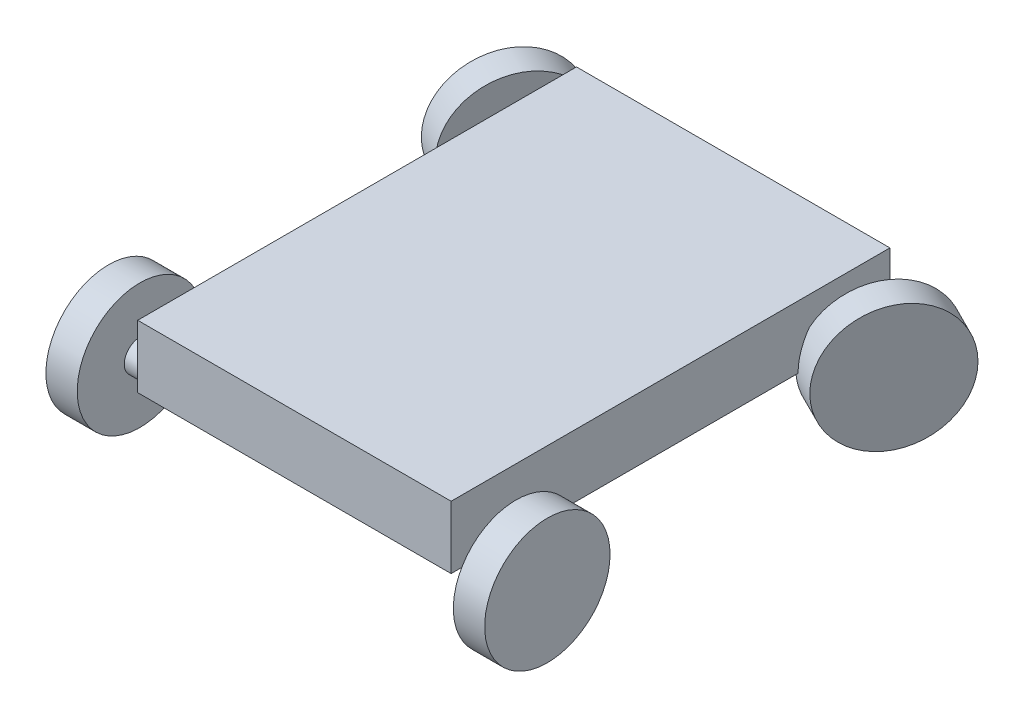
ISO-10303-21;
HEADER;
FILE_DESCRIPTION(('STEP AP214'),'2;1');
FILE_NAME('part.step','',(''),(''),'','','');
FILE_SCHEMA(('AUTOMOTIVE_DESIGN { 1 0 10303 214 1 1 1 1 }'));
ENDSEC;
DATA;
#1=APPLICATION_CONTEXT('core data for automotive mechanical design processes');
#2=APPLICATION_PROTOCOL_DEFINITION('international standard','automotive_design',2000,#1);
#3=PRODUCT_CONTEXT('',#1,'mechanical');
#4=PRODUCT('Part','Part','',(#3));
#5=PRODUCT_RELATED_PRODUCT_CATEGORY('part','',(#4));
#6=PRODUCT_DEFINITION_FORMATION('','',#4);
#7=PRODUCT_DEFINITION_CONTEXT('part definition',#1,'design');
#8=PRODUCT_DEFINITION('design','',#6,#7);
#9=PRODUCT_DEFINITION_SHAPE('','',#8);
#10=(LENGTH_UNIT() NAMED_UNIT(*) SI_UNIT(.MILLI.,.METRE.));
#11=(NAMED_UNIT(*) PLANE_ANGLE_UNIT() SI_UNIT($,.RADIAN.));
#12=(NAMED_UNIT(*) SI_UNIT($,.STERADIAN.) SOLID_ANGLE_UNIT());
#13=UNCERTAINTY_MEASURE_WITH_UNIT(LENGTH_MEASURE(1.E-05),#10,'distance_accuracy_value','');
#14=(GEOMETRIC_REPRESENTATION_CONTEXT(3) GLOBAL_UNCERTAINTY_ASSIGNED_CONTEXT((#13)) GLOBAL_UNIT_ASSIGNED_CONTEXT((#10,
#11,#12)) REPRESENTATION_CONTEXT('',''));
#15=CARTESIAN_POINT('',(0.,0.,0.));
#16=DIRECTION('',(0.,0.,1.));
#17=DIRECTION('',(1.,0.,0.));
#18=AXIS2_PLACEMENT_3D('',#15,#16,#17);
#19=CARTESIAN_POINT('',(0.,0.,0.));
#20=DIRECTION('',(0.,-1.,0.));
#21=DIRECTION('',(0.,0.,-1.));
#22=AXIS2_PLACEMENT_3D('',#19,#20,#21);
#23=PLANE('',#22);
#24=DIRECTION('',(-0.447213595499959,0.,0.894427190999916));
#25=VECTOR('',#24,1.);
#26=CARTESIAN_POINT('',(11.1412762896328,0.,5.57063814481643));
#27=LINE('',#26,#25);
#28=CARTESIAN_POINT('',(25.,0.,-22.1468092759178));
#29=VERTEX_POINT('',#28);
#30=CARTESIAN_POINT('',(24.2778640450004,0.,-20.7025373659186));
#31=VERTEX_POINT('',#30);
#32=EDGE_CURVE('E48',#29,#31,#27,.T.);
#33=ORIENTED_EDGE('',*,*,#32,.T.);
#34=DIRECTION('',(-0.894427190999916,0.,-0.447213595499959));
#35=VECTOR('',#34,1.);
#36=CARTESIAN_POINT('',(28.75,0.,-18.4664693884188));
#37=LINE('',#36,#35);
#38=CARTESIAN_POINT('',(25.,0.,-20.3414693884189));
#39=VERTEX_POINT('',#38);
#40=EDGE_CURVE('E119',#31,#39,#37,.F.);
#41=ORIENTED_EDGE('',*,*,#40,.T.);
#42=DIRECTION('',(0.,0.,-1.));
#43=VECTOR('',#42,1.);
#44=CARTESIAN_POINT('',(25.,0.,35.));
#45=LINE('',#44,#43);
#46=CARTESIAN_POINT('',(25.,0.,27.1468092759178));
#47=VERTEX_POINT('',#46);
#48=EDGE_CURVE('E108',#47,#39,#45,.T.);
#49=ORIENTED_EDGE('',*,*,#48,.F.);
#50=DIRECTION('',(1.,0.,0.));
#51=VECTOR('',#50,1.);
#52=CARTESIAN_POINT('',(-30.,0.,27.1468092759178));
#53=LINE('',#52,#51);
#54=CARTESIAN_POINT('',(-25.,0.,27.1468092759178));
#55=VERTEX_POINT('',#54);
#56=EDGE_CURVE('E207',#55,#47,#53,.T.);
#57=ORIENTED_EDGE('',*,*,#56,.F.);
#58=DIRECTION('',(0.,0.,1.));
#59=VECTOR('',#58,1.);
#60=CARTESIAN_POINT('',(-25.,0.,35.));
#61=LINE('',#60,#59);
#62=CARTESIAN_POINT('',(-25.,0.,-27.1468092759178));
#63=VERTEX_POINT('',#62);
#64=EDGE_CURVE('E191',#63,#55,#61,.T.);
#65=ORIENTED_EDGE('',*,*,#64,.F.);
#66=DIRECTION('',(1.,0.,0.));
#67=VECTOR('',#66,1.);
#68=CARTESIAN_POINT('',(-30.,0.,-27.1468092759178));
#69=LINE('',#68,#67);
#70=CARTESIAN_POINT('',(25.,0.,-27.1468092759178));
#71=VERTEX_POINT('',#70);
#72=EDGE_CURVE('E138',#63,#71,#69,.T.);
#73=ORIENTED_EDGE('',*,*,#72,.T.);
#74=EDGE_CURVE('E186',#29,#71,#45,.T.);
#75=ORIENTED_EDGE('',*,*,#74,.F.);
#76=EDGE_LOOP('',(#33,#41,#49,#57,#65,#73,#75));
#77=FACE_BOUND('',#76,.T.);
#78=ADVANCED_FACE('F33',(#77),#23,.T.);
#79=CARTESIAN_POINT('',(25.,10.,35.));
#80=DIRECTION('',(-1.,0.,0.));
#81=DIRECTION('',(0.,0.,1.));
#82=AXIS2_PLACEMENT_3D('',#79,#80,#81);
#83=PLANE('',#82);
#84=CARTESIAN_POINT('',(25.,0.,-31.5218092759178));
#85=DIRECTION('',(-1.,0.,0.));
#86=DIRECTION('',(0.,0.,-1.));
#87=AXIS2_PLACEMENT_3D('',#84,#85,#86);
#88=ELLIPSE('',#87,11.1803398874989,10.);
#89=CARTESIAN_POINT('',(25.,5.44862367942583,-22.1468092759178));
#90=VERTEX_POINT('',#89);
#91=EDGE_CURVE('E11',#90,#39,#88,.F.);
#92=ORIENTED_EDGE('',*,*,#91,.F.);
#93=DIRECTION('',(0.,1.,0.));
#94=VECTOR('',#93,1.);
#95=CARTESIAN_POINT('',(25.,10.,-22.1468092759178));
#96=LINE('',#95,#94);
#97=EDGE_CURVE('E41',#29,#90,#96,.T.);
#98=ORIENTED_EDGE('',*,*,#97,.F.);
#99=ORIENTED_EDGE('',*,*,#74,.T.);
#100=CARTESIAN_POINT('',(25.,0.,-29.6468092759178));
#101=DIRECTION('',(-1.,0.,0.));
#102=DIRECTION('',(0.,0.,1.));
#103=AXIS2_PLACEMENT_3D('',#100,#101,#102);
#104=CIRCLE('',#103,2.5);
#105=CARTESIAN_POINT('',(25.,0.,-32.1468092759178));
#106=VERTEX_POINT('',#105);
#107=EDGE_CURVE('E144',#106,#71,#104,.F.);
#108=ORIENTED_EDGE('',*,*,#107,.F.);
#109=CARTESIAN_POINT('',(25.,0.,-35.));
#110=VERTEX_POINT('',#109);
#111=EDGE_CURVE('E170',#106,#110,#45,.T.);
#112=ORIENTED_EDGE('',*,*,#111,.T.);
#113=DIRECTION('',(0.,-1.,0.));
#114=VECTOR('',#113,1.);
#115=CARTESIAN_POINT('',(25.,10.,-35.));
#116=LINE('',#115,#114);
#117=CARTESIAN_POINT('',(25.,10.,-35.));
#118=VERTEX_POINT('',#117);
#119=EDGE_CURVE('E201',#118,#110,#116,.T.);
#120=ORIENTED_EDGE('',*,*,#119,.F.);
#121=DIRECTION('',(0.,0.,-1.));
#122=VECTOR('',#121,1.);
#123=CARTESIAN_POINT('',(25.,10.,35.));
#124=LINE('',#123,#122);
#125=CARTESIAN_POINT('',(25.,10.,35.));
#126=VERTEX_POINT('',#125);
#127=EDGE_CURVE('E171',#126,#118,#124,.T.);
#128=ORIENTED_EDGE('',*,*,#127,.F.);
#129=DIRECTION('',(0.,-1.,0.));
#130=VECTOR('',#129,1.);
#131=CARTESIAN_POINT('',(25.,10.,35.));
#132=LINE('',#131,#130);
#133=CARTESIAN_POINT('',(25.,0.,35.));
#134=VERTEX_POINT('',#133);
#135=EDGE_CURVE('E181',#126,#134,#132,.T.);
#136=ORIENTED_EDGE('',*,*,#135,.T.);
#137=CARTESIAN_POINT('',(25.,0.,32.1468092759178));
#138=VERTEX_POINT('',#137);
#139=EDGE_CURVE('E182',#134,#138,#45,.T.);
#140=ORIENTED_EDGE('',*,*,#139,.T.);
#141=CARTESIAN_POINT('',(25.,0.,29.6468092759178));
#142=DIRECTION('',(-1.,0.,0.));
#143=DIRECTION('',(0.,0.,1.));
#144=AXIS2_PLACEMENT_3D('',#141,#142,#143);
#145=CIRCLE('',#144,2.5);
#146=EDGE_CURVE('E168',#138,#47,#145,.T.);
#147=ORIENTED_EDGE('',*,*,#146,.T.);
#148=ORIENTED_EDGE('',*,*,#48,.T.);
#149=EDGE_LOOP('',(#92,#98,#99,#108,#112,#120,#128,#136,#140,#147,#148));
#150=FACE_BOUND('',#149,.T.);
#151=ADVANCED_FACE('F35',(#150),#83,.F.);
#152=CARTESIAN_POINT('',(-30.,0.,-29.6468092759178));
#153=DIRECTION('',(1.,0.,0.));
#154=DIRECTION('',(0.,0.,-1.));
#155=AXIS2_PLACEMENT_3D('',#152,#153,#154);
#156=CYLINDRICAL_SURFACE('',#155,2.5);
#157=CARTESIAN_POINT('',(28.75,0.,-29.6468092759178));
#158=DIRECTION('',(0.894427190999916,0.,0.447213595499959));
#159=DIRECTION('',(0.447213595499959,0.,-0.894427190999915));
#160=AXIS2_PLACEMENT_3D('',#157,#158,#159);
#161=ELLIPSE('',#160,2.79508497187474,2.5);
#162=CARTESIAN_POINT('',(30.,0.,-32.1468092759178));
#163=VERTEX_POINT('',#162);
#164=EDGE_CURVE('E132',#163,#163,#161,.T.);
#165=ORIENTED_EDGE('',*,*,#164,.F.);
#166=EDGE_LOOP('',(#165));
#167=FACE_BOUND('',#166,.T.);
#168=DIRECTION('',(1.,0.,0.));
#169=VECTOR('',#168,1.);
#170=CARTESIAN_POINT('',(-30.,0.,-32.1468092759178));
#171=LINE('',#170,#169);
#172=CARTESIAN_POINT('',(-25.,0.,-32.1468092759178));
#173=VERTEX_POINT('',#172);
#174=EDGE_CURVE('E141',#106,#173,#171,.F.);
#175=ORIENTED_EDGE('',*,*,#174,.F.);
#176=ORIENTED_EDGE('',*,*,#107,.T.);
#177=ORIENTED_EDGE('',*,*,#72,.F.);
#178=CARTESIAN_POINT('',(-25.,0.,-29.6468092759178));
#179=DIRECTION('',(1.,0.,0.));
#180=DIRECTION('',(0.,0.,-1.));
#181=AXIS2_PLACEMENT_3D('',#178,#179,#180);
#182=CIRCLE('',#181,2.5);
#183=EDGE_CURVE('E116',#63,#173,#182,.F.);
#184=ORIENTED_EDGE('',*,*,#183,.T.);
#185=EDGE_LOOP('',(#175,#176,#177,#184));
#186=FACE_BOUND('',#185,.T.);
#187=CARTESIAN_POINT('',(-28.75,0.,-29.6468092759178));
#188=DIRECTION('',(-0.894427190999917,0.,-0.447213595499957));
#189=DIRECTION('',(0.447213595499957,0.,-0.894427190999917));
#190=AXIS2_PLACEMENT_3D('',#187,#188,#189);
#191=ELLIPSE('',#190,2.79508497187473,2.5);
#192=CARTESIAN_POINT('',(-27.5,0.,-32.1468092759178));
#193=VERTEX_POINT('',#192);
#194=EDGE_CURVE('E135',#193,#193,#191,.T.);
#195=ORIENTED_EDGE('',*,*,#194,.F.);
#196=EDGE_LOOP('',(#195));
#197=FACE_BOUND('',#196,.T.);
#198=ADVANCED_FACE('F214',(#167,#186,#197),#156,.T.);
#199=ORIENTED_EDGE('',*,*,#111,.F.);
#200=ORIENTED_EDGE('',*,*,#174,.T.);
#201=CARTESIAN_POINT('',(-25.,0.,-35.));
#202=VERTEX_POINT('',#201);
#203=EDGE_CURVE('E189',#202,#173,#61,.T.);
#204=ORIENTED_EDGE('',*,*,#203,.F.);
#205=DIRECTION('',(-1.,0.,0.));
#206=VECTOR('',#205,1.);
#207=CARTESIAN_POINT('',(-25.,0.,-35.));
#208=LINE('',#207,#206);
#209=EDGE_CURVE('E185',#110,#202,#208,.T.);
#210=ORIENTED_EDGE('',*,*,#209,.F.);
#211=EDGE_LOOP('',(#199,#200,#204,#210));
#212=FACE_BOUND('',#211,.T.);
#213=ADVANCED_FACE('F263',(#212),#23,.T.);
#214=CARTESIAN_POINT('',(-25.,10.,-35.));
#215=DIRECTION('',(0.,0.,1.));
#216=DIRECTION('',(1.,0.,0.));
#217=AXIS2_PLACEMENT_3D('',#214,#215,#216);
#218=PLANE('',#217);
#219=ORIENTED_EDGE('',*,*,#209,.T.);
#220=DIRECTION('',(0.,-1.,0.));
#221=VECTOR('',#220,1.);
#222=CARTESIAN_POINT('',(-25.,10.,-35.));
#223=LINE('',#222,#221);
#224=CARTESIAN_POINT('',(-25.,10.,-35.));
#225=VERTEX_POINT('',#224);
#226=EDGE_CURVE('E198',#225,#202,#223,.T.);
#227=ORIENTED_EDGE('',*,*,#226,.F.);
#228=DIRECTION('',(-1.,0.,0.));
#229=VECTOR('',#228,1.);
#230=CARTESIAN_POINT('',(-25.,10.,-35.));
#231=LINE('',#230,#229);
#232=EDGE_CURVE('E174',#118,#225,#231,.T.);
#233=ORIENTED_EDGE('',*,*,#232,.F.);
#234=ORIENTED_EDGE('',*,*,#119,.T.);
#235=EDGE_LOOP('',(#219,#227,#233,#234));
#236=FACE_BOUND('',#235,.T.);
#237=ADVANCED_FACE('F270',(#236),#218,.F.);
#238=CARTESIAN_POINT('',(-25.,10.,35.));
#239=DIRECTION('',(1.,0.,0.));
#240=DIRECTION('',(0.,0.,-1.));
#241=AXIS2_PLACEMENT_3D('',#238,#239,#240);
#242=PLANE('',#241);
#243=ORIENTED_EDGE('',*,*,#183,.F.);
#244=ORIENTED_EDGE('',*,*,#64,.T.);
#245=CARTESIAN_POINT('',(-25.,0.,29.6468092759178));
#246=DIRECTION('',(1.,0.,0.));
#247=DIRECTION('',(0.,0.,-1.));
#248=AXIS2_PLACEMENT_3D('',#245,#246,#247);
#249=CIRCLE('',#248,2.5);
#250=CARTESIAN_POINT('',(-25.,0.,32.1468092759178));
#251=VERTEX_POINT('',#250);
#252=EDGE_CURVE('E163',#55,#251,#249,.T.);
#253=ORIENTED_EDGE('',*,*,#252,.T.);
#254=CARTESIAN_POINT('',(-25.,0.,35.));
#255=VERTEX_POINT('',#254);
#256=EDGE_CURVE('E188',#251,#255,#61,.T.);
#257=ORIENTED_EDGE('',*,*,#256,.T.);
#258=DIRECTION('',(0.,-1.,0.));
#259=VECTOR('',#258,1.);
#260=CARTESIAN_POINT('',(-25.,10.,35.));
#261=LINE('',#260,#259);
#262=CARTESIAN_POINT('',(-25.,10.,35.));
#263=VERTEX_POINT('',#262);
#264=EDGE_CURVE('E195',#263,#255,#261,.T.);
#265=ORIENTED_EDGE('',*,*,#264,.F.);
#266=DIRECTION('',(0.,0.,1.));
#267=VECTOR('',#266,1.);
#268=CARTESIAN_POINT('',(-25.,10.,35.));
#269=LINE('',#268,#267);
#270=EDGE_CURVE('E177',#225,#263,#269,.T.);
#271=ORIENTED_EDGE('',*,*,#270,.F.);
#272=ORIENTED_EDGE('',*,*,#226,.T.);
#273=ORIENTED_EDGE('',*,*,#203,.T.);
#274=EDGE_LOOP('',(#243,#244,#253,#257,#265,#271,#272,#273));
#275=FACE_BOUND('',#274,.T.);
#276=ADVANCED_FACE('F218',(#275),#242,.F.);
#277=CARTESIAN_POINT('',(-25.,10.,35.));
#278=DIRECTION('',(0.,0.,-1.));
#279=DIRECTION('',(-1.,0.,0.));
#280=AXIS2_PLACEMENT_3D('',#277,#278,#279);
#281=PLANE('',#280);
#282=DIRECTION('',(1.,0.,0.));
#283=VECTOR('',#282,1.);
#284=CARTESIAN_POINT('',(-25.,0.,35.));
#285=LINE('',#284,#283);
#286=EDGE_CURVE('E175',#255,#134,#285,.T.);
#287=ORIENTED_EDGE('',*,*,#286,.T.);
#288=ORIENTED_EDGE('',*,*,#135,.F.);
#289=DIRECTION('',(1.,0.,0.));
#290=VECTOR('',#289,1.);
#291=CARTESIAN_POINT('',(-25.,10.,35.));
#292=LINE('',#291,#290);
#293=EDGE_CURVE('E179',#263,#126,#292,.T.);
#294=ORIENTED_EDGE('',*,*,#293,.F.);
#295=ORIENTED_EDGE('',*,*,#264,.T.);
#296=EDGE_LOOP('',(#287,#288,#294,#295));
#297=FACE_BOUND('',#296,.T.);
#298=ADVANCED_FACE('F228',(#297),#281,.F.);
#299=CARTESIAN_POINT('',(0.,10.,0.));
#300=DIRECTION('',(0.,-1.,0.));
#301=DIRECTION('',(0.,0.,-1.));
#302=AXIS2_PLACEMENT_3D('',#299,#300,#301);
#303=PLANE('',#302);
#304=ORIENTED_EDGE('',*,*,#127,.T.);
#305=ORIENTED_EDGE('',*,*,#232,.T.);
#306=ORIENTED_EDGE('',*,*,#270,.T.);
#307=ORIENTED_EDGE('',*,*,#293,.T.);
#308=EDGE_LOOP('',(#304,#305,#306,#307));
#309=FACE_BOUND('',#308,.T.);
#310=ADVANCED_FACE('F273',(#309),#303,.F.);
#311=DIRECTION('',(1.,0.,0.));
#312=VECTOR('',#311,1.);
#313=CARTESIAN_POINT('',(-30.,0.,32.1468092759178));
#314=LINE('',#313,#312);
#315=EDGE_CURVE('E204',#138,#251,#314,.F.);
#316=ORIENTED_EDGE('',*,*,#315,.F.);
#317=ORIENTED_EDGE('',*,*,#139,.F.);
#318=ORIENTED_EDGE('',*,*,#286,.F.);
#319=ORIENTED_EDGE('',*,*,#256,.F.);
#320=EDGE_LOOP('',(#316,#317,#318,#319));
#321=FACE_BOUND('',#320,.T.);
#322=ADVANCED_FACE('F231',(#321),#23,.T.);
#323=CARTESIAN_POINT('',(-30.,0.,29.6468092759178));
#324=DIRECTION('',(1.,0.,0.));
#325=DIRECTION('',(0.,0.,-1.));
#326=AXIS2_PLACEMENT_3D('',#323,#324,#325);
#327=CYLINDRICAL_SURFACE('',#326,2.5);
#328=ORIENTED_EDGE('',*,*,#252,.F.);
#329=ORIENTED_EDGE('',*,*,#56,.T.);
#330=ORIENTED_EDGE('',*,*,#146,.F.);
#331=ORIENTED_EDGE('',*,*,#315,.T.);
#332=EDGE_LOOP('',(#328,#329,#330,#331));
#333=FACE_BOUND('',#332,.T.);
#334=CARTESIAN_POINT('',(-30.,0.,29.6468092759178));
#335=DIRECTION('',(1.,0.,0.));
#336=DIRECTION('',(0.,0.,-1.));
#337=AXIS2_PLACEMENT_3D('',#334,#335,#336);
#338=CIRCLE('',#337,2.5);
#339=CARTESIAN_POINT('',(-30.,0.,27.1468092759178));
#340=VERTEX_POINT('',#339);
#341=EDGE_CURVE('E151',#340,#340,#338,.T.);
#342=ORIENTED_EDGE('',*,*,#341,.T.);
#343=EDGE_LOOP('',(#342));
#344=FACE_BOUND('',#343,.T.);
#345=CARTESIAN_POINT('',(30.,0.,29.6468092759178));
#346=DIRECTION('',(1.,0.,0.));
#347=DIRECTION('',(0.,0.,-1.));
#348=AXIS2_PLACEMENT_3D('',#345,#346,#347);
#349=CIRCLE('',#348,2.5);
#350=CARTESIAN_POINT('',(30.,0.,27.1468092759178));
#351=VERTEX_POINT('',#350);
#352=EDGE_CURVE('E157',#351,#351,#349,.T.);
#353=ORIENTED_EDGE('',*,*,#352,.F.);
#354=EDGE_LOOP('',(#353));
#355=FACE_BOUND('',#354,.T.);
#356=ADVANCED_FACE('F235',(#333,#344,#355),#327,.T.);
#357=CARTESIAN_POINT('',(35.,0.,29.6468092759178));
#358=DIRECTION('',(-1.,0.,0.));
#359=DIRECTION('',(0.,0.,1.));
#360=AXIS2_PLACEMENT_3D('',#357,#358,#359);
#361=CYLINDRICAL_SURFACE('',#360,10.);
#362=CARTESIAN_POINT('',(35.,0.,29.6468092759178));
#363=DIRECTION('',(1.,0.,0.));
#364=DIRECTION('',(0.,0.,-1.));
#365=AXIS2_PLACEMENT_3D('',#362,#363,#364);
#366=CIRCLE('',#365,10.);
#367=CARTESIAN_POINT('',(35.,0.,19.6468092759178));
#368=VERTEX_POINT('',#367);
#369=EDGE_CURVE('E154',#368,#368,#366,.T.);
#370=ORIENTED_EDGE('',*,*,#369,.F.);
#371=EDGE_LOOP('',(#370));
#372=FACE_BOUND('',#371,.T.);
#373=CARTESIAN_POINT('',(30.,0.,29.6468092759178));
#374=DIRECTION('',(1.,0.,0.));
#375=DIRECTION('',(0.,0.,-1.));
#376=AXIS2_PLACEMENT_3D('',#373,#374,#375);
#377=CIRCLE('',#376,10.);
#378=CARTESIAN_POINT('',(30.,0.,19.6468092759178));
#379=VERTEX_POINT('',#378);
#380=EDGE_CURVE('E158',#379,#379,#377,.T.);
#381=ORIENTED_EDGE('',*,*,#380,.T.);
#382=EDGE_LOOP('',(#381));
#383=FACE_BOUND('',#382,.T.);
#384=ADVANCED_FACE('F238',(#372,#383),#361,.T.);
#385=CARTESIAN_POINT('',(35.,0.,29.6468092759178));
#386=DIRECTION('',(1.,0.,0.));
#387=DIRECTION('',(0.,0.,-1.));
#388=AXIS2_PLACEMENT_3D('',#385,#386,#387);
#389=PLANE('',#388);
#390=ORIENTED_EDGE('',*,*,#369,.T.);
#391=EDGE_LOOP('',(#390));
#392=FACE_BOUND('',#391,.T.);
#393=ADVANCED_FACE('F248',(#392),#389,.T.);
#394=CARTESIAN_POINT('',(30.,0.,29.6468092759178));
#395=DIRECTION('',(1.,0.,0.));
#396=DIRECTION('',(0.,0.,-1.));
#397=AXIS2_PLACEMENT_3D('',#394,#395,#396);
#398=PLANE('',#397);
#399=ORIENTED_EDGE('',*,*,#352,.T.);
#400=EDGE_LOOP('',(#399));
#401=FACE_BOUND('',#400,.T.);
#402=ORIENTED_EDGE('',*,*,#380,.F.);
#403=EDGE_LOOP('',(#402));
#404=FACE_BOUND('',#403,.T.);
#405=ADVANCED_FACE('F244',(#401,#404),#398,.F.);
#406=CARTESIAN_POINT('',(-35.,0.,29.6468092759178));
#407=DIRECTION('',(1.,0.,0.));
#408=DIRECTION('',(0.,0.,-1.));
#409=AXIS2_PLACEMENT_3D('',#406,#407,#408);
#410=CYLINDRICAL_SURFACE('',#409,10.);
#411=CARTESIAN_POINT('',(-35.,0.,29.6468092759178));
#412=DIRECTION('',(1.,0.,0.));
#413=DIRECTION('',(0.,0.,-1.));
#414=AXIS2_PLACEMENT_3D('',#411,#412,#413);
#415=CIRCLE('',#414,10.);
#416=CARTESIAN_POINT('',(-35.,0.,19.6468092759178));
#417=VERTEX_POINT('',#416);
#418=EDGE_CURVE('E148',#417,#417,#415,.T.);
#419=ORIENTED_EDGE('',*,*,#418,.T.);
#420=EDGE_LOOP('',(#419));
#421=FACE_BOUND('',#420,.T.);
#422=CARTESIAN_POINT('',(-30.,0.,29.6468092759178));
#423=DIRECTION('',(1.,0.,0.));
#424=DIRECTION('',(0.,0.,-1.));
#425=AXIS2_PLACEMENT_3D('',#422,#423,#424);
#426=CIRCLE('',#425,10.);
#427=CARTESIAN_POINT('',(-30.,0.,19.6468092759178));
#428=VERTEX_POINT('',#427);
#429=EDGE_CURVE('E147',#428,#428,#426,.T.);
#430=ORIENTED_EDGE('',*,*,#429,.F.);
#431=EDGE_LOOP('',(#430));
#432=FACE_BOUND('',#431,.T.);
#433=ADVANCED_FACE('F247',(#421,#432),#410,.T.);
#434=CARTESIAN_POINT('',(-35.,0.,29.6468092759178));
#435=DIRECTION('',(-1.,0.,0.));
#436=DIRECTION('',(0.,0.,-1.));
#437=AXIS2_PLACEMENT_3D('',#434,#435,#436);
#438=PLANE('',#437);
#439=ORIENTED_EDGE('',*,*,#418,.F.);
#440=EDGE_LOOP('',(#439));
#441=FACE_BOUND('',#440,.T.);
#442=ADVANCED_FACE('F340',(#441),#438,.T.);
#443=CARTESIAN_POINT('',(-30.,0.,29.6468092759178));
#444=DIRECTION('',(-1.,0.,0.));
#445=DIRECTION('',(0.,0.,-1.));
#446=AXIS2_PLACEMENT_3D('',#443,#444,#445);
#447=PLANE('',#446);
#448=ORIENTED_EDGE('',*,*,#341,.F.);
#449=EDGE_LOOP('',(#448));
#450=FACE_BOUND('',#449,.T.);
#451=ORIENTED_EDGE('',*,*,#429,.T.);
#452=EDGE_LOOP('',(#451));
#453=FACE_BOUND('',#452,.T.);
#454=ADVANCED_FACE('F350',(#450,#453),#447,.F.);
#455=CARTESIAN_POINT('',(28.75,0.,-29.6468092759178));
#456=DIRECTION('',(0.894427190999916,0.,0.447213595499959));
#457=DIRECTION('',(0.447213595499959,0.,-0.894427190999916));
#458=AXIS2_PLACEMENT_3D('',#455,#456,#457);
#459=PLANE('',#458);
#460=ORIENTED_EDGE('',*,*,#32,.F.);
#461=ORIENTED_EDGE('',*,*,#97,.T.);
#462=CARTESIAN_POINT('',(28.75,0.,-29.6468092759178));
#463=DIRECTION('',(0.894427190999916,0.,0.447213595499959));
#464=DIRECTION('',(0.447213595499959,0.,-0.894427190999916));
#465=AXIS2_PLACEMENT_3D('',#462,#463,#464);
#466=CIRCLE('',#465,10.);
#467=EDGE_CURVE('E115',#31,#90,#466,.T.);
#468=ORIENTED_EDGE('',*,*,#467,.F.);
#469=EDGE_LOOP('',(#460,#461,#468));
#470=FACE_BOUND('',#469,.T.);
#471=ORIENTED_EDGE('',*,*,#164,.T.);
#472=EDGE_LOOP('',(#471));
#473=FACE_BOUND('',#472,.T.);
#474=ADVANCED_FACE('F113',(#470,#473),#459,.F.);
#475=CARTESIAN_POINT('',(33.2221359549996,0.,-27.410741298418));
#476=DIRECTION('',(-0.894427190999916,0.,-0.447213595499959));
#477=DIRECTION('',(-0.447213595499959,0.,0.894427190999916));
#478=AXIS2_PLACEMENT_3D('',#475,#476,#477);
#479=CYLINDRICAL_SURFACE('',#478,10.);
#480=ORIENTED_EDGE('',*,*,#40,.F.);
#481=ORIENTED_EDGE('',*,*,#467,.T.);
#482=ORIENTED_EDGE('',*,*,#91,.T.);
#483=EDGE_LOOP('',(#480,#481,#482));
#484=FACE_BOUND('',#483,.T.);
#485=CARTESIAN_POINT('',(33.2221359549996,0.,-27.410741298418));
#486=DIRECTION('',(0.894427190999916,0.,0.447213595499959));
#487=DIRECTION('',(0.447213595499959,0.,-0.894427190999916));
#488=AXIS2_PLACEMENT_3D('',#485,#486,#487);
#489=CIRCLE('',#488,10.);
#490=CARTESIAN_POINT('',(37.6942719099991,0.,-36.3550132084171));
#491=VERTEX_POINT('',#490);
#492=EDGE_CURVE('E120',#491,#491,#489,.T.);
#493=ORIENTED_EDGE('',*,*,#492,.F.);
#494=EDGE_LOOP('',(#493));
#495=FACE_BOUND('',#494,.T.);
#496=ADVANCED_FACE('F117',(#484,#495),#479,.T.);
#497=CARTESIAN_POINT('',(33.2221359549996,0.,-27.410741298418));
#498=DIRECTION('',(0.894427190999916,0.,0.447213595499959));
#499=DIRECTION('',(0.447213595499959,0.,-0.894427190999916));
#500=AXIS2_PLACEMENT_3D('',#497,#498,#499);
#501=PLANE('',#500);
#502=ORIENTED_EDGE('',*,*,#492,.T.);
#503=EDGE_LOOP('',(#502));
#504=FACE_BOUND('',#503,.T.);
#505=ADVANCED_FACE('F396',(#504),#501,.T.);
#506=CARTESIAN_POINT('',(-33.2221359549996,0.,-31.8828772534176));
#507=DIRECTION('',(0.894427190999917,0.,0.447213595499957));
#508=DIRECTION('',(0.447213595499957,0.,-0.894427190999917));
#509=AXIS2_PLACEMENT_3D('',#506,#507,#508);
#510=CYLINDRICAL_SURFACE('',#509,10.);
#511=CARTESIAN_POINT('',(-33.2221359549996,0.,-31.8828772534176));
#512=DIRECTION('',(-0.894427190999917,0.,-0.447213595499957));
#513=DIRECTION('',(-0.447213595499957,0.,0.894427190999917));
#514=AXIS2_PLACEMENT_3D('',#511,#512,#513);
#515=CIRCLE('',#514,10.);
#516=CARTESIAN_POINT('',(-37.6942719099992,0.,-22.9386053434184));
#517=VERTEX_POINT('',#516);
#518=EDGE_CURVE('E121',#517,#517,#515,.T.);
#519=ORIENTED_EDGE('',*,*,#518,.F.);
#520=EDGE_LOOP('',(#519));
#521=FACE_BOUND('',#520,.T.);
#522=CARTESIAN_POINT('',(-28.75,0.,-29.6468092759178));
#523=DIRECTION('',(-0.894427190999917,0.,-0.447213595499957));
#524=DIRECTION('',(-0.447213595499957,0.,0.894427190999917));
#525=AXIS2_PLACEMENT_3D('',#522,#523,#524);
#526=CIRCLE('',#525,10.);
#527=CARTESIAN_POINT('',(-33.2221359549996,0.,-20.7025373659186));
#528=VERTEX_POINT('',#527);
#529=EDGE_CURVE('E126',#528,#528,#526,.T.);
#530=ORIENTED_EDGE('',*,*,#529,.T.);
#531=EDGE_LOOP('',(#530));
#532=FACE_BOUND('',#531,.T.);
#533=ADVANCED_FACE('F405',(#521,#532),#510,.T.);
#534=CARTESIAN_POINT('',(-33.2221359549996,0.,-31.8828772534176));
#535=DIRECTION('',(-0.894427190999917,0.,-0.447213595499957));
#536=DIRECTION('',(-0.447213595499957,0.,0.894427190999917));
#537=AXIS2_PLACEMENT_3D('',#534,#535,#536);
#538=PLANE('',#537);
#539=ORIENTED_EDGE('',*,*,#518,.T.);
#540=EDGE_LOOP('',(#539));
#541=FACE_BOUND('',#540,.T.);
#542=ADVANCED_FACE('F415',(#541),#538,.T.);
#543=CARTESIAN_POINT('',(-28.75,0.,-29.6468092759178));
#544=DIRECTION('',(-0.894427190999917,0.,-0.447213595499957));
#545=DIRECTION('',(-0.447213595499957,0.,0.894427190999917));
#546=AXIS2_PLACEMENT_3D('',#543,#544,#545);
#547=PLANE('',#546);
#548=ORIENTED_EDGE('',*,*,#194,.T.);
#549=EDGE_LOOP('',(#548));
#550=FACE_BOUND('',#549,.T.);
#551=ORIENTED_EDGE('',*,*,#529,.F.);
#552=EDGE_LOOP('',(#551));
#553=FACE_BOUND('',#552,.T.);
#554=ADVANCED_FACE('F425',(#550,#553),#547,.F.);
#555=CLOSED_SHELL('',(#78,#151,#198,#213,#237,#276,#298,#310,#322,#356,#384,#393,#405,#433,#442,
#454,#474,#496,#505,#533,#542,#554));
#556=MANIFOLD_SOLID_BREP('B2',#555);
#557=ADVANCED_BREP_SHAPE_REPRESENTATION('',(#18,#556),#14);
#558=SHAPE_DEFINITION_REPRESENTATION(#9,#557);
ENDSEC;
END-ISO-10303-21;
